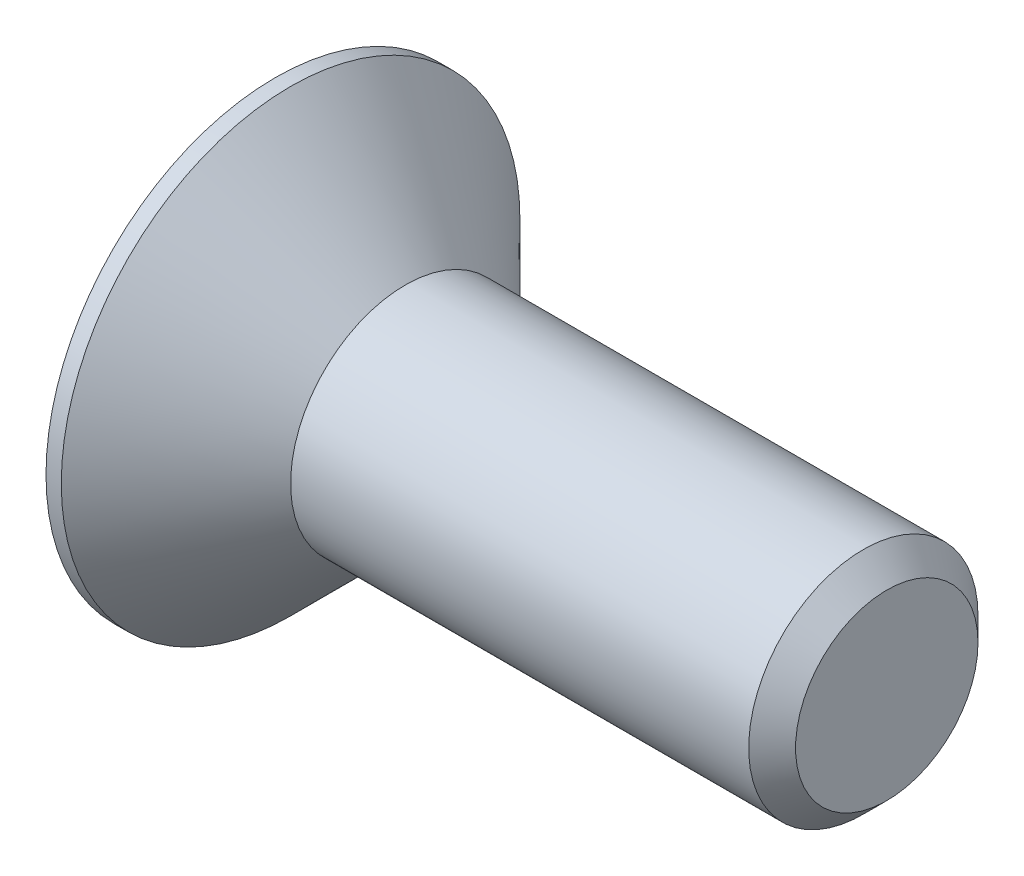
ISO-10303-21;
HEADER;
FILE_DESCRIPTION(('STEP AP214'),'2;1');
FILE_NAME('part.step','',(''),(''),'','','');
FILE_SCHEMA(('AUTOMOTIVE_DESIGN { 1 0 10303 214 1 1 1 1 }'));
ENDSEC;
DATA;
#1=APPLICATION_CONTEXT('core data for automotive mechanical design processes');
#2=APPLICATION_PROTOCOL_DEFINITION('international standard','automotive_design',2000,#1);
#3=PRODUCT_CONTEXT('',#1,'mechanical');
#4=PRODUCT('Part','Part','',(#3));
#5=PRODUCT_RELATED_PRODUCT_CATEGORY('part','',(#4));
#6=PRODUCT_DEFINITION_FORMATION('','',#4);
#7=PRODUCT_DEFINITION_CONTEXT('part definition',#1,'design');
#8=PRODUCT_DEFINITION('design','',#6,#7);
#9=PRODUCT_DEFINITION_SHAPE('','',#8);
#10=(LENGTH_UNIT() NAMED_UNIT(*) SI_UNIT(.MILLI.,.METRE.));
#11=(NAMED_UNIT(*) PLANE_ANGLE_UNIT() SI_UNIT($,.RADIAN.));
#12=(NAMED_UNIT(*) SI_UNIT($,.STERADIAN.) SOLID_ANGLE_UNIT());
#13=UNCERTAINTY_MEASURE_WITH_UNIT(LENGTH_MEASURE(1.E-05),#10,'distance_accuracy_value','');
#14=(GEOMETRIC_REPRESENTATION_CONTEXT(3) GLOBAL_UNCERTAINTY_ASSIGNED_CONTEXT((#13)) GLOBAL_UNIT_ASSIGNED_CONTEXT((#10,
#11,#12)) REPRESENTATION_CONTEXT('',''));
#15=CARTESIAN_POINT('',(0.,0.,0.));
#16=DIRECTION('',(0.,0.,1.));
#17=DIRECTION('',(1.,0.,0.));
#18=AXIS2_PLACEMENT_3D('',#15,#16,#17);
#19=CARTESIAN_POINT('',(-1.7,0.,0.));
#20=DIRECTION('',(1.,0.,0.));
#21=DIRECTION('',(0.,0.,-1.));
#22=AXIS2_PLACEMENT_3D('',#19,#20,#21);
#23=PLANE('',#22);
#24=CARTESIAN_POINT('',(-1.7,0.,0.));
#25=DIRECTION('',(1.,0.,0.));
#26=DIRECTION('',(0.,0.,-1.));
#27=AXIS2_PLACEMENT_3D('',#24,#25,#26);
#28=CIRCLE('',#27,3.);
#29=CARTESIAN_POINT('',(-1.7,0.,-3.));
#30=VERTEX_POINT('',#29);
#31=EDGE_CURVE('E11',#30,#30,#28,.T.);
#32=ORIENTED_EDGE('',*,*,#31,.F.);
#33=EDGE_LOOP('',(#32));
#34=FACE_BOUND('',#33,.T.);
#35=DIRECTION('',(0.,0.5,-0.866025403784439));
#36=VECTOR('',#35,1.);
#37=CARTESIAN_POINT('',(-1.7,-1.15470053837925,0.));
#38=LINE('',#37,#36);
#39=CARTESIAN_POINT('',(-1.7,-1.15470053837925,0.));
#40=VERTEX_POINT('',#39);
#41=CARTESIAN_POINT('',(-1.7,-0.577350269189626,-1.));
#42=VERTEX_POINT('',#41);
#43=EDGE_CURVE('E149',#40,#42,#38,.T.);
#44=ORIENTED_EDGE('',*,*,#43,.T.);
#45=DIRECTION('',(0.,1.,0.));
#46=VECTOR('',#45,1.);
#47=CARTESIAN_POINT('',(-1.7,-0.577350269189626,-1.));
#48=LINE('',#47,#46);
#49=CARTESIAN_POINT('',(-1.7,0.577350269189626,-1.));
#50=VERTEX_POINT('',#49);
#51=EDGE_CURVE('E151',#42,#50,#48,.T.);
#52=ORIENTED_EDGE('',*,*,#51,.T.);
#53=DIRECTION('',(0.,0.5,0.866025403784439));
#54=VECTOR('',#53,1.);
#55=CARTESIAN_POINT('',(-1.7,0.577350269189626,-1.));
#56=LINE('',#55,#54);
#57=CARTESIAN_POINT('',(-1.7,1.15470053837925,0.));
#58=VERTEX_POINT('',#57);
#59=EDGE_CURVE('E154',#50,#58,#56,.T.);
#60=ORIENTED_EDGE('',*,*,#59,.T.);
#61=DIRECTION('',(0.,-0.5,0.866025403784439));
#62=VECTOR('',#61,1.);
#63=CARTESIAN_POINT('',(-1.7,1.15470053837925,0.));
#64=LINE('',#63,#62);
#65=CARTESIAN_POINT('',(-1.7,0.577350269189626,1.));
#66=VERTEX_POINT('',#65);
#67=EDGE_CURVE('E99',#58,#66,#64,.T.);
#68=ORIENTED_EDGE('',*,*,#67,.T.);
#69=DIRECTION('',(0.,-1.,0.));
#70=VECTOR('',#69,1.);
#71=CARTESIAN_POINT('',(-1.7,0.577350269189626,1.));
#72=LINE('',#71,#70);
#73=CARTESIAN_POINT('',(-1.7,-0.577350269189626,1.));
#74=VERTEX_POINT('',#73);
#75=EDGE_CURVE('E156',#66,#74,#72,.T.);
#76=ORIENTED_EDGE('',*,*,#75,.T.);
#77=DIRECTION('',(0.,-0.5,-0.866025403784439));
#78=VECTOR('',#77,1.);
#79=CARTESIAN_POINT('',(-1.7,-0.577350269189626,1.));
#80=LINE('',#79,#78);
#81=EDGE_CURVE('E114',#74,#40,#80,.T.);
#82=ORIENTED_EDGE('',*,*,#81,.T.);
#83=EDGE_LOOP('',(#44,#52,#60,#68,#76,#82));
#84=FACE_BOUND('',#83,.T.);
#85=ADVANCED_FACE('F16',(#34,#84),#23,.F.);
#86=CARTESIAN_POINT('',(6.3,0.,0.));
#87=DIRECTION('',(1.,0.,0.));
#88=DIRECTION('',(0.,0.,-1.));
#89=AXIS2_PLACEMENT_3D('',#86,#87,#88);
#90=CYLINDRICAL_SURFACE('',#89,3.);
#91=CARTESIAN_POINT('',(-1.5,0.,0.));
#92=DIRECTION('',(1.,0.,0.));
#93=DIRECTION('',(0.,0.,-1.));
#94=AXIS2_PLACEMENT_3D('',#91,#92,#93);
#95=CIRCLE('',#94,3.);
#96=CARTESIAN_POINT('',(-1.5,0.,-3.));
#97=VERTEX_POINT('',#96);
#98=EDGE_CURVE('E23',#97,#97,#95,.T.);
#99=ORIENTED_EDGE('',*,*,#98,.F.);
#100=EDGE_LOOP('',(#99));
#101=FACE_BOUND('',#100,.T.);
#102=ORIENTED_EDGE('',*,*,#31,.T.);
#103=EDGE_LOOP('',(#102));
#104=FACE_BOUND('',#103,.T.);
#105=ADVANCED_FACE('F140',(#101,#104),#90,.T.);
#106=CARTESIAN_POINT('',(-1.5,0.,0.));
#107=DIRECTION('',(-1.,0.,0.));
#108=DIRECTION('',(0.,0.,1.));
#109=AXIS2_PLACEMENT_3D('',#106,#107,#108);
#110=CONICAL_SURFACE('',#109,3.,0.785398163397449);
#111=CARTESIAN_POINT('',(0.,0.,0.));
#112=DIRECTION('',(1.,0.,0.));
#113=DIRECTION('',(0.,0.,-1.));
#114=AXIS2_PLACEMENT_3D('',#111,#112,#113);
#115=CIRCLE('',#114,1.5);
#116=CARTESIAN_POINT('',(0.,0.,-1.5));
#117=VERTEX_POINT('',#116);
#118=EDGE_CURVE('E133',#117,#117,#115,.T.);
#119=ORIENTED_EDGE('',*,*,#118,.F.);
#120=EDGE_LOOP('',(#119));
#121=FACE_BOUND('',#120,.T.);
#122=ORIENTED_EDGE('',*,*,#98,.T.);
#123=EDGE_LOOP('',(#122));
#124=FACE_BOUND('',#123,.T.);
#125=ADVANCED_FACE('F138',(#121,#124),#110,.T.);
#126=CARTESIAN_POINT('',(6.3,0.,0.));
#127=DIRECTION('',(1.,0.,0.));
#128=DIRECTION('',(0.,0.,-1.));
#129=AXIS2_PLACEMENT_3D('',#126,#127,#128);
#130=CYLINDRICAL_SURFACE('',#129,1.5);
#131=CARTESIAN_POINT('',(5.9935,0.,0.));
#132=DIRECTION('',(1.,0.,0.));
#133=DIRECTION('',(0.,0.,-1.));
#134=AXIS2_PLACEMENT_3D('',#131,#132,#133);
#135=CIRCLE('',#134,1.5);
#136=CARTESIAN_POINT('',(5.9935,0.,-1.5));
#137=VERTEX_POINT('',#136);
#138=EDGE_CURVE('E130',#137,#137,#135,.T.);
#139=ORIENTED_EDGE('',*,*,#138,.F.);
#140=EDGE_LOOP('',(#139));
#141=FACE_BOUND('',#140,.T.);
#142=ORIENTED_EDGE('',*,*,#118,.T.);
#143=EDGE_LOOP('',(#142));
#144=FACE_BOUND('',#143,.T.);
#145=ADVANCED_FACE('F243',(#141,#144),#130,.T.);
#146=CARTESIAN_POINT('',(5.9935,0.,0.));
#147=DIRECTION('',(-1.,0.,0.));
#148=DIRECTION('',(0.,0.,1.));
#149=AXIS2_PLACEMENT_3D('',#146,#147,#148);
#150=CONICAL_SURFACE('',#149,1.5,0.785398163397449);
#151=CARTESIAN_POINT('',(6.3,0.,0.));
#152=DIRECTION('',(1.,0.,0.));
#153=DIRECTION('',(0.,0.,-1.));
#154=AXIS2_PLACEMENT_3D('',#151,#152,#153);
#155=CIRCLE('',#154,1.1935);
#156=CARTESIAN_POINT('',(6.3,0.,-1.1935));
#157=VERTEX_POINT('',#156);
#158=EDGE_CURVE('E126',#157,#157,#155,.T.);
#159=ORIENTED_EDGE('',*,*,#158,.F.);
#160=EDGE_LOOP('',(#159));
#161=FACE_BOUND('',#160,.T.);
#162=ORIENTED_EDGE('',*,*,#138,.T.);
#163=EDGE_LOOP('',(#162));
#164=FACE_BOUND('',#163,.T.);
#165=ADVANCED_FACE('F239',(#161,#164),#150,.T.);
#166=CARTESIAN_POINT('',(6.3,1.1935,0.));
#167=DIRECTION('',(-1.,0.,0.));
#168=DIRECTION('',(0.,0.,1.));
#169=AXIS2_PLACEMENT_3D('',#166,#167,#168);
#170=PLANE('',#169);
#171=ORIENTED_EDGE('',*,*,#158,.T.);
#172=EDGE_LOOP('',(#171));
#173=FACE_BOUND('',#172,.T.);
#174=ADVANCED_FACE('F234',(#173),#170,.F.);
#175=CARTESIAN_POINT('',(-0.85,0.577350269189626,1.));
#176=DIRECTION('',(0.,0.,-1.));
#177=DIRECTION('',(-1.,0.,0.));
#178=AXIS2_PLACEMENT_3D('',#175,#176,#177);
#179=PLANE('',#178);
#180=ORIENTED_EDGE('',*,*,#75,.F.);
#181=DIRECTION('',(-1.,0.,0.));
#182=VECTOR('',#181,1.);
#183=CARTESIAN_POINT('',(-0.85,0.577350269189626,1.));
#184=LINE('',#183,#182);
#185=CARTESIAN_POINT('',(-0.85,0.577350269189626,1.));
#186=VERTEX_POINT('',#185);
#187=EDGE_CURVE('E163',#186,#66,#184,.T.);
#188=ORIENTED_EDGE('',*,*,#187,.F.);
#189=DIRECTION('',(0.,-1.,0.));
#190=VECTOR('',#189,1.);
#191=CARTESIAN_POINT('',(-0.85,0.577350269189626,1.));
#192=LINE('',#191,#190);
#193=CARTESIAN_POINT('',(-0.85,0.,1.));
#194=VERTEX_POINT('',#193);
#195=EDGE_CURVE('E96',#186,#194,#192,.T.);
#196=ORIENTED_EDGE('',*,*,#195,.T.);
#197=CARTESIAN_POINT('',(-0.85,-0.577350269189626,1.));
#198=VERTEX_POINT('',#197);
#199=EDGE_CURVE('E88',#194,#198,#192,.T.);
#200=ORIENTED_EDGE('',*,*,#199,.T.);
#201=DIRECTION('',(-1.,0.,0.));
#202=VECTOR('',#201,1.);
#203=CARTESIAN_POINT('',(-0.85,-0.577350269189626,1.));
#204=LINE('',#203,#202);
#205=EDGE_CURVE('E92',#198,#74,#204,.T.);
#206=ORIENTED_EDGE('',*,*,#205,.T.);
#207=EDGE_LOOP('',(#180,#188,#196,#200,#206));
#208=FACE_BOUND('',#207,.T.);
#209=ADVANCED_FACE('F90',(#208),#179,.T.);
#210=CARTESIAN_POINT('',(-0.85,-0.577350269189626,1.));
#211=DIRECTION('',(0.,0.866025403784439,-0.5));
#212=DIRECTION('',(0.,0.5,0.866025403784439));
#213=AXIS2_PLACEMENT_3D('',#210,#211,#212);
#214=PLANE('',#213);
#215=ORIENTED_EDGE('',*,*,#81,.F.);
#216=ORIENTED_EDGE('',*,*,#205,.F.);
#217=DIRECTION('',(0.,-0.5,-0.866025403784439));
#218=VECTOR('',#217,1.);
#219=CARTESIAN_POINT('',(-0.85,-0.577350269189626,1.));
#220=LINE('',#219,#218);
#221=CARTESIAN_POINT('',(-0.85,-0.866025403784439,0.5));
#222=VERTEX_POINT('',#221);
#223=EDGE_CURVE('E102',#198,#222,#220,.T.);
#224=ORIENTED_EDGE('',*,*,#223,.T.);
#225=CARTESIAN_POINT('',(-0.85,-1.15470053837925,0.));
#226=VERTEX_POINT('',#225);
#227=EDGE_CURVE('E109',#222,#226,#220,.T.);
#228=ORIENTED_EDGE('',*,*,#227,.T.);
#229=DIRECTION('',(-1.,0.,0.));
#230=VECTOR('',#229,1.);
#231=CARTESIAN_POINT('',(-0.85,-1.15470053837925,0.));
#232=LINE('',#231,#230);
#233=EDGE_CURVE('E116',#226,#40,#232,.T.);
#234=ORIENTED_EDGE('',*,*,#233,.T.);
#235=EDGE_LOOP('',(#215,#216,#224,#228,#234));
#236=FACE_BOUND('',#235,.T.);
#237=ADVANCED_FACE('F111',(#236),#214,.T.);
#238=CARTESIAN_POINT('',(-0.85,-1.15470053837925,0.));
#239=DIRECTION('',(0.,0.866025403784439,0.5));
#240=DIRECTION('',(0.,-0.5,0.866025403784439));
#241=AXIS2_PLACEMENT_3D('',#238,#239,#240);
#242=PLANE('',#241);
#243=ORIENTED_EDGE('',*,*,#43,.F.);
#244=ORIENTED_EDGE('',*,*,#233,.F.);
#245=DIRECTION('',(0.,0.5,-0.866025403784439));
#246=VECTOR('',#245,1.);
#247=CARTESIAN_POINT('',(-0.85,-1.15470053837925,0.));
#248=LINE('',#247,#246);
#249=CARTESIAN_POINT('',(-0.85,-0.866025403784439,-0.5));
#250=VERTEX_POINT('',#249);
#251=EDGE_CURVE('E30',#226,#250,#248,.T.);
#252=ORIENTED_EDGE('',*,*,#251,.T.);
#253=CARTESIAN_POINT('',(-0.85,-0.577350269189626,-1.));
#254=VERTEX_POINT('',#253);
#255=EDGE_CURVE('E108',#250,#254,#248,.T.);
#256=ORIENTED_EDGE('',*,*,#255,.T.);
#257=DIRECTION('',(-1.,0.,0.));
#258=VECTOR('',#257,1.);
#259=CARTESIAN_POINT('',(-0.85,-0.577350269189626,-1.));
#260=LINE('',#259,#258);
#261=EDGE_CURVE('E122',#254,#42,#260,.T.);
#262=ORIENTED_EDGE('',*,*,#261,.T.);
#263=EDGE_LOOP('',(#243,#244,#252,#256,#262));
#264=FACE_BOUND('',#263,.T.);
#265=ADVANCED_FACE('F173',(#264),#242,.T.);
#266=CARTESIAN_POINT('',(-0.85,-0.577350269189626,-1.));
#267=DIRECTION('',(0.,0.,1.));
#268=DIRECTION('',(1.,0.,0.));
#269=AXIS2_PLACEMENT_3D('',#266,#267,#268);
#270=PLANE('',#269);
#271=ORIENTED_EDGE('',*,*,#51,.F.);
#272=ORIENTED_EDGE('',*,*,#261,.F.);
#273=DIRECTION('',(0.,1.,0.));
#274=VECTOR('',#273,1.);
#275=CARTESIAN_POINT('',(-0.85,-0.577350269189626,-1.));
#276=LINE('',#275,#274);
#277=CARTESIAN_POINT('',(-0.85,0.,-1.));
#278=VERTEX_POINT('',#277);
#279=EDGE_CURVE('E178',#254,#278,#276,.T.);
#280=ORIENTED_EDGE('',*,*,#279,.T.);
#281=CARTESIAN_POINT('',(-0.85,0.577350269189626,-1.));
#282=VERTEX_POINT('',#281);
#283=EDGE_CURVE('E186',#278,#282,#276,.T.);
#284=ORIENTED_EDGE('',*,*,#283,.T.);
#285=DIRECTION('',(-1.,0.,0.));
#286=VECTOR('',#285,1.);
#287=CARTESIAN_POINT('',(-0.85,0.577350269189626,-1.));
#288=LINE('',#287,#286);
#289=EDGE_CURVE('E170',#282,#50,#288,.T.);
#290=ORIENTED_EDGE('',*,*,#289,.T.);
#291=EDGE_LOOP('',(#271,#272,#280,#284,#290));
#292=FACE_BOUND('',#291,.T.);
#293=ADVANCED_FACE('F177',(#292),#270,.T.);
#294=CARTESIAN_POINT('',(-0.85,0.577350269189626,-1.));
#295=DIRECTION('',(0.,-0.866025403784439,0.5));
#296=DIRECTION('',(0.,-0.5,-0.866025403784439));
#297=AXIS2_PLACEMENT_3D('',#294,#295,#296);
#298=PLANE('',#297);
#299=ORIENTED_EDGE('',*,*,#59,.F.);
#300=ORIENTED_EDGE('',*,*,#289,.F.);
#301=DIRECTION('',(0.,0.5,0.866025403784439));
#302=VECTOR('',#301,1.);
#303=CARTESIAN_POINT('',(-0.85,0.577350269189626,-1.));
#304=LINE('',#303,#302);
#305=CARTESIAN_POINT('',(-0.85,0.866025403784439,-0.5));
#306=VERTEX_POINT('',#305);
#307=EDGE_CURVE('E188',#282,#306,#304,.T.);
#308=ORIENTED_EDGE('',*,*,#307,.T.);
#309=CARTESIAN_POINT('',(-0.85,1.15470053837925,0.));
#310=VERTEX_POINT('',#309);
#311=EDGE_CURVE('E185',#306,#310,#304,.T.);
#312=ORIENTED_EDGE('',*,*,#311,.T.);
#313=DIRECTION('',(-1.,0.,0.));
#314=VECTOR('',#313,1.);
#315=CARTESIAN_POINT('',(-0.85,1.15470053837925,0.));
#316=LINE('',#315,#314);
#317=EDGE_CURVE('E166',#310,#58,#316,.T.);
#318=ORIENTED_EDGE('',*,*,#317,.T.);
#319=EDGE_LOOP('',(#299,#300,#308,#312,#318));
#320=FACE_BOUND('',#319,.T.);
#321=ADVANCED_FACE('F216',(#320),#298,.T.);
#322=CARTESIAN_POINT('',(-0.85,1.15470053837925,0.));
#323=DIRECTION('',(0.,-0.866025403784439,-0.5));
#324=DIRECTION('',(0.,0.5,-0.866025403784439));
#325=AXIS2_PLACEMENT_3D('',#322,#323,#324);
#326=PLANE('',#325);
#327=ORIENTED_EDGE('',*,*,#67,.F.);
#328=ORIENTED_EDGE('',*,*,#317,.F.);
#329=DIRECTION('',(0.,-0.5,0.866025403784439));
#330=VECTOR('',#329,1.);
#331=CARTESIAN_POINT('',(-0.85,1.15470053837925,0.));
#332=LINE('',#331,#330);
#333=CARTESIAN_POINT('',(-0.85,0.866025403784439,0.5));
#334=VERTEX_POINT('',#333);
#335=EDGE_CURVE('E167',#310,#334,#332,.T.);
#336=ORIENTED_EDGE('',*,*,#335,.T.);
#337=EDGE_CURVE('E193',#334,#186,#332,.T.);
#338=ORIENTED_EDGE('',*,*,#337,.T.);
#339=ORIENTED_EDGE('',*,*,#187,.T.);
#340=EDGE_LOOP('',(#327,#328,#336,#338,#339));
#341=FACE_BOUND('',#340,.T.);
#342=ADVANCED_FACE('F196',(#341),#326,.T.);
#343=CARTESIAN_POINT('',(-0.85,0.,0.));
#344=DIRECTION('',(1.,0.,0.));
#345=DIRECTION('',(0.,0.,-1.));
#346=AXIS2_PLACEMENT_3D('',#343,#344,#345);
#347=PLANE('',#346);
#348=CARTESIAN_POINT('',(-0.85,0.,0.));
#349=DIRECTION('',(1.,0.,0.));
#350=DIRECTION('',(0.,0.,-1.));
#351=AXIS2_PLACEMENT_3D('',#348,#349,#350);
#352=CIRCLE('',#351,1.);
#353=EDGE_CURVE('E115',#278,#306,#352,.T.);
#354=ORIENTED_EDGE('',*,*,#353,.T.);
#355=ORIENTED_EDGE('',*,*,#307,.F.);
#356=ORIENTED_EDGE('',*,*,#283,.F.);
#357=EDGE_LOOP('',(#354,#355,#356));
#358=FACE_BOUND('',#357,.T.);
#359=ADVANCED_FACE('F211',(#358),#347,.F.);
#360=ORIENTED_EDGE('',*,*,#311,.F.);
#361=EDGE_CURVE('E121',#306,#334,#352,.T.);
#362=ORIENTED_EDGE('',*,*,#361,.T.);
#363=ORIENTED_EDGE('',*,*,#335,.F.);
#364=EDGE_LOOP('',(#360,#362,#363));
#365=FACE_BOUND('',#364,.T.);
#366=ADVANCED_FACE('F213',(#365),#347,.F.);
#367=EDGE_CURVE('E127',#334,#194,#352,.T.);
#368=ORIENTED_EDGE('',*,*,#367,.T.);
#369=ORIENTED_EDGE('',*,*,#195,.F.);
#370=ORIENTED_EDGE('',*,*,#337,.F.);
#371=EDGE_LOOP('',(#368,#369,#370));
#372=FACE_BOUND('',#371,.T.);
#373=ADVANCED_FACE('F202',(#372),#347,.F.);
#374=EDGE_CURVE('E104',#194,#222,#352,.T.);
#375=ORIENTED_EDGE('',*,*,#374,.T.);
#376=ORIENTED_EDGE('',*,*,#223,.F.);
#377=ORIENTED_EDGE('',*,*,#199,.F.);
#378=EDGE_LOOP('',(#375,#376,#377));
#379=FACE_BOUND('',#378,.T.);
#380=ADVANCED_FACE('F103',(#379),#347,.F.);
#381=EDGE_CURVE('E205',#222,#250,#352,.T.);
#382=ORIENTED_EDGE('',*,*,#381,.T.);
#383=ORIENTED_EDGE('',*,*,#251,.F.);
#384=ORIENTED_EDGE('',*,*,#227,.F.);
#385=EDGE_LOOP('',(#382,#383,#384));
#386=FACE_BOUND('',#385,.T.);
#387=ADVANCED_FACE('F204',(#386),#347,.F.);
#388=EDGE_CURVE('E119',#250,#278,#352,.T.);
#389=ORIENTED_EDGE('',*,*,#388,.T.);
#390=ORIENTED_EDGE('',*,*,#279,.F.);
#391=ORIENTED_EDGE('',*,*,#255,.F.);
#392=EDGE_LOOP('',(#389,#390,#391));
#393=FACE_BOUND('',#392,.T.);
#394=ADVANCED_FACE('F181',(#393),#347,.F.);
#395=CARTESIAN_POINT('',(-0.85,0.,0.));
#396=DIRECTION('',(-1.,0.,0.));
#397=DIRECTION('',(0.,0.,1.));
#398=AXIS2_PLACEMENT_3D('',#395,#396,#397);
#399=CONICAL_SURFACE('',#398,1.,1.30899693899575);
#400=CARTESIAN_POINT('',(-0.582050807568878,0.,0.));
#401=VERTEX_POINT('',#400);
#402=VERTEX_LOOP('',#401);
#403=FACE_BOUND('',#402,.T.);
#404=ORIENTED_EDGE('',*,*,#361,.F.);
#405=ORIENTED_EDGE('',*,*,#353,.F.);
#406=ORIENTED_EDGE('',*,*,#388,.F.);
#407=ORIENTED_EDGE('',*,*,#381,.F.);
#408=ORIENTED_EDGE('',*,*,#374,.F.);
#409=ORIENTED_EDGE('',*,*,#367,.F.);
#410=EDGE_LOOP('',(#404,#405,#406,#407,#408,#409));
#411=FACE_BOUND('',#410,.T.);
#412=ADVANCED_FACE('F207',(#403,#411),#399,.F.);
#413=CLOSED_SHELL('',(#85,#105,#125,#145,#165,#174,#209,#237,#265,#293,#321,#342,#359,#366,#373,
#380,#387,#394,#412));
#414=MANIFOLD_SOLID_BREP('B1',#413);
#415=ADVANCED_BREP_SHAPE_REPRESENTATION('',(#18,#414),#14);
#416=SHAPE_DEFINITION_REPRESENTATION(#9,#415);
ENDSEC;
END-ISO-10303-21;
